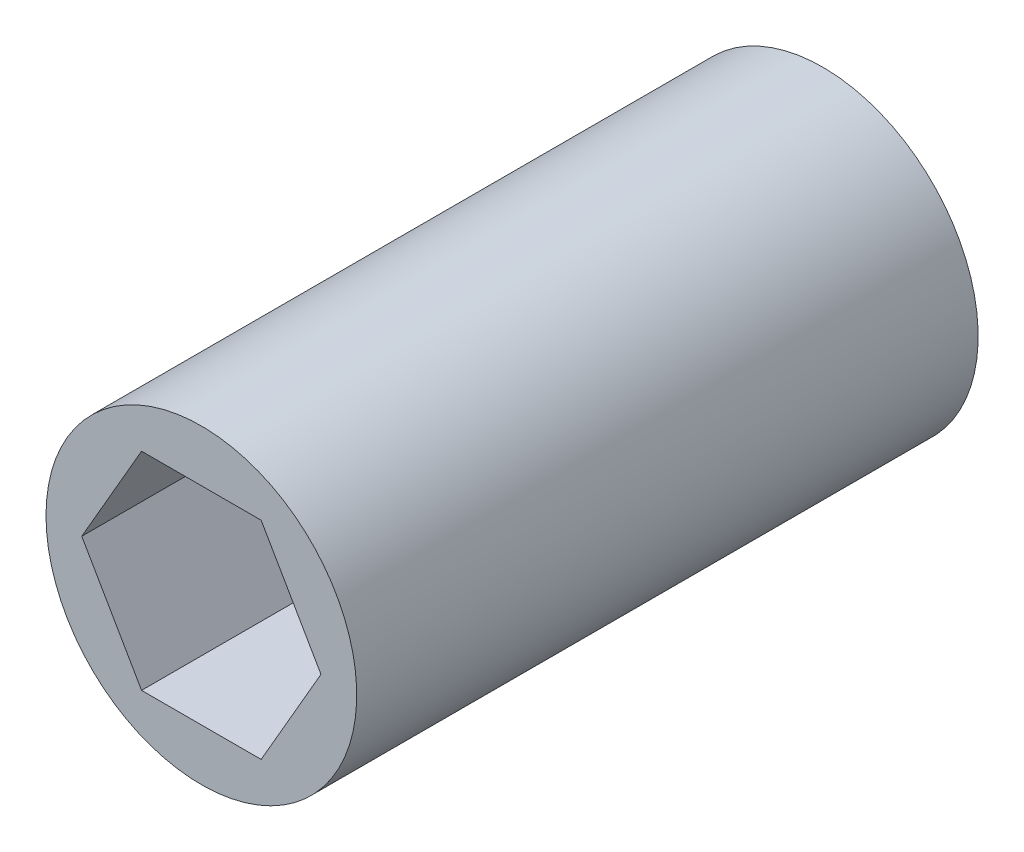
ISO-10303-21;
HEADER;
FILE_DESCRIPTION(('STEP AP214'),'2;1');
FILE_NAME('part.step','',(''),(''),'','','');
FILE_SCHEMA(('AUTOMOTIVE_DESIGN { 1 0 10303 214 1 1 1 1 }'));
ENDSEC;
DATA;
#1=APPLICATION_CONTEXT('core data for automotive mechanical design processes');
#2=APPLICATION_PROTOCOL_DEFINITION('international standard','automotive_design',2000,#1);
#3=PRODUCT_CONTEXT('',#1,'mechanical');
#4=PRODUCT('Part','Part','',(#3));
#5=PRODUCT_RELATED_PRODUCT_CATEGORY('part','',(#4));
#6=PRODUCT_DEFINITION_FORMATION('','',#4);
#7=PRODUCT_DEFINITION_CONTEXT('part definition',#1,'design');
#8=PRODUCT_DEFINITION('design','',#6,#7);
#9=PRODUCT_DEFINITION_SHAPE('','',#8);
#10=(LENGTH_UNIT() NAMED_UNIT(*) SI_UNIT(.MILLI.,.METRE.));
#11=(NAMED_UNIT(*) PLANE_ANGLE_UNIT() SI_UNIT($,.RADIAN.));
#12=(NAMED_UNIT(*) SI_UNIT($,.STERADIAN.) SOLID_ANGLE_UNIT());
#13=UNCERTAINTY_MEASURE_WITH_UNIT(LENGTH_MEASURE(1.E-05),#10,'distance_accuracy_value','');
#14=(GEOMETRIC_REPRESENTATION_CONTEXT(3) GLOBAL_UNCERTAINTY_ASSIGNED_CONTEXT((#13)) GLOBAL_UNIT_ASSIGNED_CONTEXT((#10,
#11,#12)) REPRESENTATION_CONTEXT('',''));
#15=CARTESIAN_POINT('',(0.,0.,0.));
#16=DIRECTION('',(0.,0.,1.));
#17=DIRECTION('',(1.,0.,0.));
#18=AXIS2_PLACEMENT_3D('',#15,#16,#17);
#19=CARTESIAN_POINT('',(0.,0.,38.1));
#20=DIRECTION('',(0.,0.,1.));
#21=DIRECTION('',(1.,0.,0.));
#22=AXIS2_PLACEMENT_3D('',#19,#20,#21);
#23=PLANE('',#22);
#24=CARTESIAN_POINT('',(0.,0.,38.1));
#25=DIRECTION('',(0.,0.,1.));
#26=DIRECTION('',(1.,0.,0.));
#27=AXIS2_PLACEMENT_3D('',#24,#25,#26);
#28=CIRCLE('',#27,9.525);
#29=CARTESIAN_POINT('',(-9.525,0.,38.1));
#30=VERTEX_POINT('',#29);
#31=EDGE_CURVE('E11',#30,#30,#28,.T.);
#32=ORIENTED_EDGE('',*,*,#31,.T.);
#33=EDGE_LOOP('',(#32));
#34=FACE_BOUND('',#33,.T.);
#35=DIRECTION('',(0.5,-0.866025403784438,0.));
#36=VECTOR('',#35,1.);
#37=CARTESIAN_POINT('',(-7.33234841870825,0.,38.1));
#38=LINE('',#37,#36);
#39=CARTESIAN_POINT('',(-7.33234841870825,0.,38.1));
#40=VERTEX_POINT('',#39);
#41=CARTESIAN_POINT('',(-3.66617420935412,-6.35,38.1));
#42=VERTEX_POINT('',#41);
#43=EDGE_CURVE('E94',#40,#42,#38,.T.);
#44=ORIENTED_EDGE('',*,*,#43,.F.);
#45=DIRECTION('',(-0.5,-0.866025403784439,0.));
#46=VECTOR('',#45,1.);
#47=CARTESIAN_POINT('',(-3.66617420935412,6.35,38.1));
#48=LINE('',#47,#46);
#49=CARTESIAN_POINT('',(-3.66617420935412,6.35,38.1));
#50=VERTEX_POINT('',#49);
#51=EDGE_CURVE('E86',#50,#40,#48,.T.);
#52=ORIENTED_EDGE('',*,*,#51,.F.);
#53=DIRECTION('',(-1.,0.,0.));
#54=VECTOR('',#53,1.);
#55=CARTESIAN_POINT('',(3.66617420935412,6.35,38.1));
#56=LINE('',#55,#54);
#57=CARTESIAN_POINT('',(3.66617420935412,6.35,38.1));
#58=VERTEX_POINT('',#57);
#59=EDGE_CURVE('E114',#58,#50,#56,.T.);
#60=ORIENTED_EDGE('',*,*,#59,.F.);
#61=DIRECTION('',(-0.5,0.866025403784439,0.));
#62=VECTOR('',#61,1.);
#63=CARTESIAN_POINT('',(7.33234841870825,0.,38.1));
#64=LINE('',#63,#62);
#65=CARTESIAN_POINT('',(7.33234841870825,0.,38.1));
#66=VERTEX_POINT('',#65);
#67=EDGE_CURVE('E112',#66,#58,#64,.T.);
#68=ORIENTED_EDGE('',*,*,#67,.F.);
#69=DIRECTION('',(0.5,0.866025403784439,0.));
#70=VECTOR('',#69,1.);
#71=CARTESIAN_POINT('',(3.66617420935412,-6.35,38.1));
#72=LINE('',#71,#70);
#73=CARTESIAN_POINT('',(3.66617420935412,-6.35,38.1));
#74=VERTEX_POINT('',#73);
#75=EDGE_CURVE('E108',#74,#66,#72,.T.);
#76=ORIENTED_EDGE('',*,*,#75,.F.);
#77=DIRECTION('',(1.,0.,0.));
#78=VECTOR('',#77,1.);
#79=CARTESIAN_POINT('',(-3.66617420935412,-6.35,38.1));
#80=LINE('',#79,#78);
#81=EDGE_CURVE('E106',#42,#74,#80,.T.);
#82=ORIENTED_EDGE('',*,*,#81,.F.);
#83=EDGE_LOOP('',(#44,#52,#60,#68,#76,#82));
#84=FACE_BOUND('',#83,.T.);
#85=ADVANCED_FACE('F33',(#34,#84),#23,.T.);
#86=CARTESIAN_POINT('',(0.,0.,0.));
#87=DIRECTION('',(0.,0.,1.));
#88=DIRECTION('',(1.,0.,0.));
#89=AXIS2_PLACEMENT_3D('',#86,#87,#88);
#90=PLANE('',#89);
#91=CARTESIAN_POINT('',(0.,0.,0.));
#92=DIRECTION('',(0.,0.,1.));
#93=DIRECTION('',(1.,0.,0.));
#94=AXIS2_PLACEMENT_3D('',#91,#92,#93);
#95=CIRCLE('',#94,9.525);
#96=CARTESIAN_POINT('',(-9.525,0.,0.));
#97=VERTEX_POINT('',#96);
#98=EDGE_CURVE('E37',#97,#97,#95,.T.);
#99=ORIENTED_EDGE('',*,*,#98,.F.);
#100=EDGE_LOOP('',(#99));
#101=FACE_BOUND('',#100,.T.);
#102=DIRECTION('',(-0.5,-0.866025403784439,0.));
#103=VECTOR('',#102,1.);
#104=CARTESIAN_POINT('',(-3.66617420935412,6.35,0.));
#105=LINE('',#104,#103);
#106=CARTESIAN_POINT('',(-3.66617420935412,6.35,0.));
#107=VERTEX_POINT('',#106);
#108=CARTESIAN_POINT('',(-7.33234841870825,0.,0.));
#109=VERTEX_POINT('',#108);
#110=EDGE_CURVE('E56',#107,#109,#105,.T.);
#111=ORIENTED_EDGE('',*,*,#110,.T.);
#112=DIRECTION('',(0.5,-0.866025403784438,0.));
#113=VECTOR('',#112,1.);
#114=CARTESIAN_POINT('',(-7.33234841870825,0.,0.));
#115=LINE('',#114,#113);
#116=CARTESIAN_POINT('',(-3.66617420935412,-6.35,0.));
#117=VERTEX_POINT('',#116);
#118=EDGE_CURVE('E101',#109,#117,#115,.T.);
#119=ORIENTED_EDGE('',*,*,#118,.T.);
#120=DIRECTION('',(1.,0.,0.));
#121=VECTOR('',#120,1.);
#122=CARTESIAN_POINT('',(-3.66617420935412,-6.35,0.));
#123=LINE('',#122,#121);
#124=CARTESIAN_POINT('',(3.66617420935412,-6.35,0.));
#125=VERTEX_POINT('',#124);
#126=EDGE_CURVE('E118',#117,#125,#123,.T.);
#127=ORIENTED_EDGE('',*,*,#126,.T.);
#128=DIRECTION('',(0.5,0.866025403784439,0.));
#129=VECTOR('',#128,1.);
#130=CARTESIAN_POINT('',(3.66617420935412,-6.35,0.));
#131=LINE('',#130,#129);
#132=CARTESIAN_POINT('',(7.33234841870825,0.,0.));
#133=VERTEX_POINT('',#132);
#134=EDGE_CURVE('E121',#125,#133,#131,.T.);
#135=ORIENTED_EDGE('',*,*,#134,.T.);
#136=DIRECTION('',(-0.5,0.866025403784439,0.));
#137=VECTOR('',#136,1.);
#138=CARTESIAN_POINT('',(7.33234841870825,0.,0.));
#139=LINE('',#138,#137);
#140=CARTESIAN_POINT('',(3.66617420935412,6.35,0.));
#141=VERTEX_POINT('',#140);
#142=EDGE_CURVE('E124',#133,#141,#139,.T.);
#143=ORIENTED_EDGE('',*,*,#142,.T.);
#144=DIRECTION('',(-1.,0.,0.));
#145=VECTOR('',#144,1.);
#146=CARTESIAN_POINT('',(3.66617420935412,6.35,0.));
#147=LINE('',#146,#145);
#148=EDGE_CURVE('E95',#141,#107,#147,.T.);
#149=ORIENTED_EDGE('',*,*,#148,.T.);
#150=EDGE_LOOP('',(#111,#119,#127,#135,#143,#149));
#151=FACE_BOUND('',#150,.T.);
#152=ADVANCED_FACE('F141',(#101,#151),#90,.F.);
#153=CARTESIAN_POINT('',(0.,0.,38.1));
#154=DIRECTION('',(0.,0.,-1.));
#155=DIRECTION('',(-1.,0.,0.));
#156=AXIS2_PLACEMENT_3D('',#153,#154,#155);
#157=CYLINDRICAL_SURFACE('',#156,9.525);
#158=CARTESIAN_POINT('',(-9.525,0.,38.1));
#159=CARTESIAN_POINT('',(-9.525,0.,37.703125));
#160=CARTESIAN_POINT('',(-9.525,0.,37.30625));
#161=CARTESIAN_POINT('',(-9.525,0.,36.5125));
#162=CARTESIAN_POINT('',(-9.525,0.,36.115625));
#163=CARTESIAN_POINT('',(-9.525,0.,35.321875));
#164=CARTESIAN_POINT('',(-9.525,0.,34.925));
#165=CARTESIAN_POINT('',(-9.525,0.,34.13125));
#166=CARTESIAN_POINT('',(-9.525,0.,33.734375));
#167=CARTESIAN_POINT('',(-9.525,0.,32.940625));
#168=CARTESIAN_POINT('',(-9.525,0.,32.54375));
#169=CARTESIAN_POINT('',(-9.525,0.,31.75));
#170=CARTESIAN_POINT('',(-9.525,0.,31.353125));
#171=CARTESIAN_POINT('',(-9.525,0.,30.559375));
#172=CARTESIAN_POINT('',(-9.525,0.,30.1625));
#173=CARTESIAN_POINT('',(-9.525,0.,29.36875));
#174=CARTESIAN_POINT('',(-9.525,0.,28.971875));
#175=CARTESIAN_POINT('',(-9.525,0.,28.178125));
#176=CARTESIAN_POINT('',(-9.525,0.,27.78125));
#177=CARTESIAN_POINT('',(-9.525,0.,26.9875));
#178=CARTESIAN_POINT('',(-9.525,0.,26.590625));
#179=CARTESIAN_POINT('',(-9.525,0.,25.796875));
#180=CARTESIAN_POINT('',(-9.525,0.,25.4));
#181=CARTESIAN_POINT('',(-9.525,0.,24.60625));
#182=CARTESIAN_POINT('',(-9.525,0.,24.209375));
#183=CARTESIAN_POINT('',(-9.525,0.,23.415625));
#184=CARTESIAN_POINT('',(-9.525,0.,23.01875));
#185=CARTESIAN_POINT('',(-9.525,0.,22.225));
#186=CARTESIAN_POINT('',(-9.525,0.,21.828125));
#187=CARTESIAN_POINT('',(-9.525,0.,21.034375));
#188=CARTESIAN_POINT('',(-9.525,0.,20.6375));
#189=CARTESIAN_POINT('',(-9.525,0.,19.84375));
#190=CARTESIAN_POINT('',(-9.525,0.,19.446875));
#191=CARTESIAN_POINT('',(-9.525,0.,18.653125));
#192=CARTESIAN_POINT('',(-9.525,0.,18.25625));
#193=CARTESIAN_POINT('',(-9.525,0.,17.4625));
#194=CARTESIAN_POINT('',(-9.525,0.,17.065625));
#195=CARTESIAN_POINT('',(-9.525,0.,16.271875));
#196=CARTESIAN_POINT('',(-9.525,0.,15.875));
#197=CARTESIAN_POINT('',(-9.525,0.,15.08125));
#198=CARTESIAN_POINT('',(-9.525,0.,14.684375));
#199=CARTESIAN_POINT('',(-9.525,0.,13.890625));
#200=CARTESIAN_POINT('',(-9.525,0.,13.49375));
#201=CARTESIAN_POINT('',(-9.525,0.,12.7));
#202=CARTESIAN_POINT('',(-9.525,0.,12.303125));
#203=CARTESIAN_POINT('',(-9.525,0.,11.509375));
#204=CARTESIAN_POINT('',(-9.525,0.,11.1125));
#205=CARTESIAN_POINT('',(-9.525,0.,10.31875));
#206=CARTESIAN_POINT('',(-9.525,0.,9.92187499999999));
#207=CARTESIAN_POINT('',(-9.525,0.,9.128125));
#208=CARTESIAN_POINT('',(-9.525,0.,8.73124999999999));
#209=CARTESIAN_POINT('',(-9.525,0.,7.93749999999999));
#210=CARTESIAN_POINT('',(-9.525,0.,7.54062499999999));
#211=CARTESIAN_POINT('',(-9.525,0.,6.746875));
#212=CARTESIAN_POINT('',(-9.525,0.,6.35));
#213=CARTESIAN_POINT('',(-9.525,0.,5.55625));
#214=CARTESIAN_POINT('',(-9.525,0.,5.159375));
#215=CARTESIAN_POINT('',(-9.525,0.,4.365625));
#216=CARTESIAN_POINT('',(-9.525,0.,3.96875));
#217=CARTESIAN_POINT('',(-9.525,0.,3.175));
#218=CARTESIAN_POINT('',(-9.525,0.,2.778125));
#219=CARTESIAN_POINT('',(-9.525,0.,1.984375));
#220=CARTESIAN_POINT('',(-9.525,0.,1.5875));
#221=CARTESIAN_POINT('',(-9.525,0.,0.79375));
#222=CARTESIAN_POINT('',(-9.525,0.,0.396875));
#223=CARTESIAN_POINT('',(-9.525,0.,0.));
#224=B_SPLINE_CURVE_WITH_KNOTS('',3,(#158,#159,#160,#161,#162,#163,#164,#165,#166,#167,#168,
#169,#170,#171,#172,#173,#174,#175,#176,#177,#178,#179,#180,#181,#182,#183,#184,#185,#186,#187,
#188,#189,#190,#191,#192,#193,#194,#195,#196,#197,#198,#199,#200,#201,#202,#203,#204,#205,#206,
#207,#208,#209,#210,#211,#212,#213,#214,#215,#216,#217,#218,#219,#220,#221,#222,#223),
.UNSPECIFIED.,.F.,.F.,(4,2,2,2,2,2,2,2,2,2,2,2,2,2,2,2,2,2,2,2,2,2,2,2,2,2,2,2,2,2,2,2,4),(0.,
1.190625,2.38125,3.571875,4.7625,5.953125,7.14375,8.334375,9.52500000000001,10.715625,11.90625,
13.096875,14.2875,15.478125,16.66875,17.859375,19.05,20.240625,21.43125,22.621875,23.8125,
25.003125,26.19375,27.384375,28.575,29.765625,30.95625,32.146875,33.3375,34.528125,35.71875,
36.909375,38.1),.UNSPECIFIED.);
#225=EDGE_CURVE('BSEAM35',#30,#97,#224,.T.);
#226=ORIENTED_EDGE('',*,*,#31,.F.);
#227=ORIENTED_EDGE('',*,*,#98,.T.);
#228=ORIENTED_EDGE('',*,*,#225,.T.);
#229=ORIENTED_EDGE('',*,*,#225,.F.);
#230=EDGE_LOOP('',(#226,#228,#227,#229));
#231=FACE_BOUND('',#230,.T.);
#232=ADVANCED_FACE('F35',(#231),#157,.T.);
#233=CARTESIAN_POINT('',(-3.66617420935412,6.35,38.1));
#234=DIRECTION('',(0.866025403784439,-0.5,0.));
#235=DIRECTION('',(0.5,0.866025403784439,0.));
#236=AXIS2_PLACEMENT_3D('',#233,#234,#235);
#237=PLANE('',#236);
#238=ORIENTED_EDGE('',*,*,#110,.F.);
#239=DIRECTION('',(0.,0.,-1.));
#240=VECTOR('',#239,1.);
#241=CARTESIAN_POINT('',(-3.66617420935412,6.35,38.1));
#242=LINE('',#241,#240);
#243=EDGE_CURVE('E90',#50,#107,#242,.T.);
#244=ORIENTED_EDGE('',*,*,#243,.F.);
#245=ORIENTED_EDGE('',*,*,#51,.T.);
#246=DIRECTION('',(0.,0.,-1.));
#247=VECTOR('',#246,1.);
#248=CARTESIAN_POINT('',(-7.33234841870825,0.,38.1));
#249=LINE('',#248,#247);
#250=EDGE_CURVE('E89',#40,#109,#249,.T.);
#251=ORIENTED_EDGE('',*,*,#250,.T.);
#252=EDGE_LOOP('',(#238,#244,#245,#251));
#253=FACE_BOUND('',#252,.T.);
#254=ADVANCED_FACE('F88',(#253),#237,.T.);
#255=CARTESIAN_POINT('',(-7.33234841870825,0.,38.1));
#256=DIRECTION('',(0.866025403784439,0.5,0.));
#257=DIRECTION('',(-0.5,0.866025403784439,0.));
#258=AXIS2_PLACEMENT_3D('',#255,#256,#257);
#259=PLANE('',#258);
#260=ORIENTED_EDGE('',*,*,#118,.F.);
#261=ORIENTED_EDGE('',*,*,#250,.F.);
#262=ORIENTED_EDGE('',*,*,#43,.T.);
#263=DIRECTION('',(0.,0.,-1.));
#264=VECTOR('',#263,1.);
#265=CARTESIAN_POINT('',(-3.66617420935412,-6.35,38.1));
#266=LINE('',#265,#264);
#267=EDGE_CURVE('E102',#42,#117,#266,.T.);
#268=ORIENTED_EDGE('',*,*,#267,.T.);
#269=EDGE_LOOP('',(#260,#261,#262,#268));
#270=FACE_BOUND('',#269,.T.);
#271=ADVANCED_FACE('F98',(#270),#259,.T.);
#272=CARTESIAN_POINT('',(-3.66617420935412,-6.35,38.1));
#273=DIRECTION('',(0.,1.,0.));
#274=DIRECTION('',(-1.,0.,0.));
#275=AXIS2_PLACEMENT_3D('',#272,#273,#274);
#276=PLANE('',#275);
#277=ORIENTED_EDGE('',*,*,#126,.F.);
#278=ORIENTED_EDGE('',*,*,#267,.F.);
#279=ORIENTED_EDGE('',*,*,#81,.T.);
#280=DIRECTION('',(0.,0.,-1.));
#281=VECTOR('',#280,1.);
#282=CARTESIAN_POINT('',(3.66617420935412,-6.35,38.1));
#283=LINE('',#282,#281);
#284=EDGE_CURVE('E133',#74,#125,#283,.T.);
#285=ORIENTED_EDGE('',*,*,#284,.T.);
#286=EDGE_LOOP('',(#277,#278,#279,#285));
#287=FACE_BOUND('',#286,.T.);
#288=ADVANCED_FACE('F137',(#287),#276,.T.);
#289=CARTESIAN_POINT('',(3.66617420935412,-6.35,38.1));
#290=DIRECTION('',(-0.866025403784439,0.5,0.));
#291=DIRECTION('',(-0.5,-0.866025403784439,0.));
#292=AXIS2_PLACEMENT_3D('',#289,#290,#291);
#293=PLANE('',#292);
#294=ORIENTED_EDGE('',*,*,#134,.F.);
#295=ORIENTED_EDGE('',*,*,#284,.F.);
#296=ORIENTED_EDGE('',*,*,#75,.T.);
#297=DIRECTION('',(0.,0.,-1.));
#298=VECTOR('',#297,1.);
#299=CARTESIAN_POINT('',(7.33234841870825,0.,38.1));
#300=LINE('',#299,#298);
#301=EDGE_CURVE('E131',#66,#133,#300,.T.);
#302=ORIENTED_EDGE('',*,*,#301,.T.);
#303=EDGE_LOOP('',(#294,#295,#296,#302));
#304=FACE_BOUND('',#303,.T.);
#305=ADVANCED_FACE('F149',(#304),#293,.T.);
#306=CARTESIAN_POINT('',(7.33234841870825,0.,38.1));
#307=DIRECTION('',(-0.866025403784439,-0.5,0.));
#308=DIRECTION('',(0.5,-0.866025403784438,0.));
#309=AXIS2_PLACEMENT_3D('',#306,#307,#308);
#310=PLANE('',#309);
#311=ORIENTED_EDGE('',*,*,#142,.F.);
#312=ORIENTED_EDGE('',*,*,#301,.F.);
#313=ORIENTED_EDGE('',*,*,#67,.T.);
#314=DIRECTION('',(0.,0.,-1.));
#315=VECTOR('',#314,1.);
#316=CARTESIAN_POINT('',(3.66617420935412,6.35,38.1));
#317=LINE('',#316,#315);
#318=EDGE_CURVE('E48',#58,#141,#317,.T.);
#319=ORIENTED_EDGE('',*,*,#318,.T.);
#320=EDGE_LOOP('',(#311,#312,#313,#319));
#321=FACE_BOUND('',#320,.T.);
#322=ADVANCED_FACE('F147',(#321),#310,.T.);
#323=CARTESIAN_POINT('',(3.66617420935412,6.35,38.1));
#324=DIRECTION('',(0.,-1.,0.));
#325=DIRECTION('',(1.,0.,0.));
#326=AXIS2_PLACEMENT_3D('',#323,#324,#325);
#327=PLANE('',#326);
#328=ORIENTED_EDGE('',*,*,#148,.F.);
#329=ORIENTED_EDGE('',*,*,#318,.F.);
#330=ORIENTED_EDGE('',*,*,#59,.T.);
#331=ORIENTED_EDGE('',*,*,#243,.T.);
#332=EDGE_LOOP('',(#328,#329,#330,#331));
#333=FACE_BOUND('',#332,.T.);
#334=ADVANCED_FACE('F143',(#333),#327,.T.);
#335=CLOSED_SHELL('',(#85,#152,#232,#254,#271,#288,#305,#322,#334));
#336=MANIFOLD_SOLID_BREP('B2',#335);
#337=ADVANCED_BREP_SHAPE_REPRESENTATION('',(#18,#336),#14);
#338=SHAPE_DEFINITION_REPRESENTATION(#9,#337);
ENDSEC;
END-ISO-10303-21;
